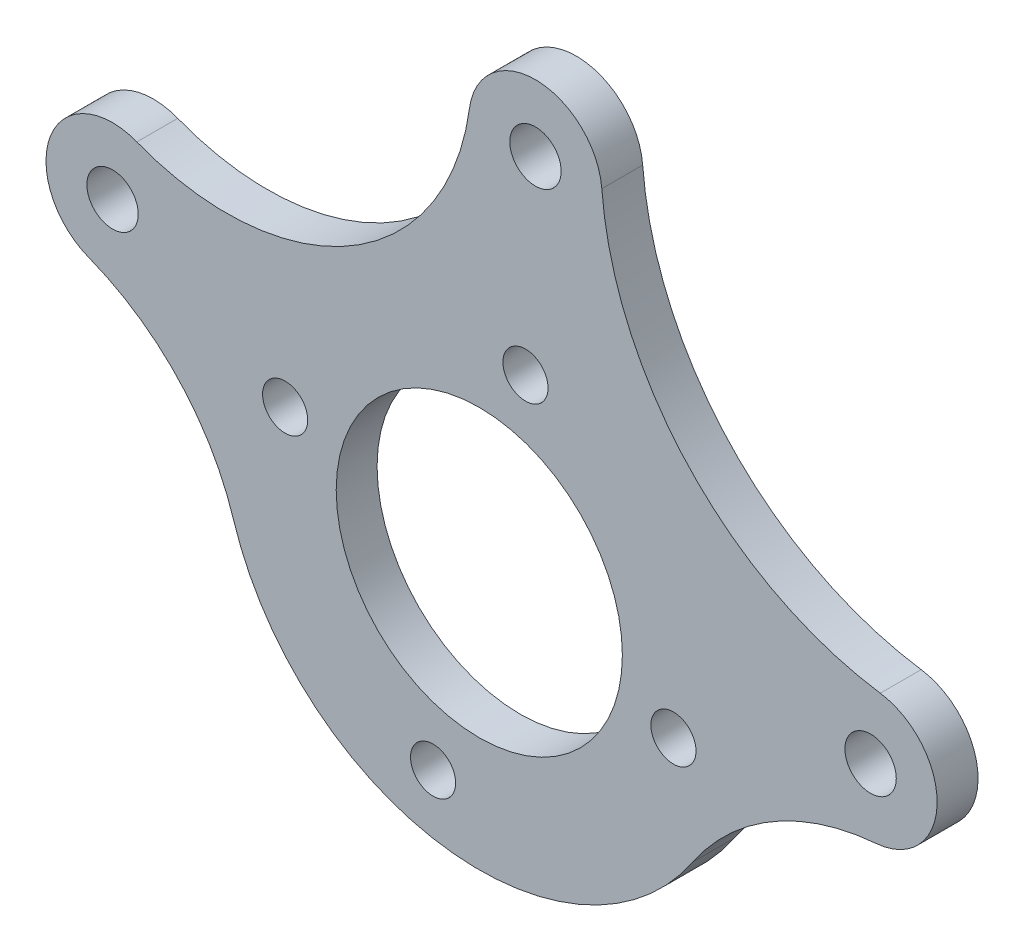
ISO-10303-21;
HEADER;
FILE_DESCRIPTION(('STEP AP214'),'2;1');
FILE_NAME('part.step','',(''),(''),'','','');
FILE_SCHEMA(('AUTOMOTIVE_DESIGN { 1 0 10303 214 1 1 1 1 }'));
ENDSEC;
DATA;
#1=APPLICATION_CONTEXT('core data for automotive mechanical design processes');
#2=APPLICATION_PROTOCOL_DEFINITION('international standard','automotive_design',2000,#1);
#3=PRODUCT_CONTEXT('',#1,'mechanical');
#4=PRODUCT('Part','Part','',(#3));
#5=PRODUCT_RELATED_PRODUCT_CATEGORY('part','',(#4));
#6=PRODUCT_DEFINITION_FORMATION('','',#4);
#7=PRODUCT_DEFINITION_CONTEXT('part definition',#1,'design');
#8=PRODUCT_DEFINITION('design','',#6,#7);
#9=PRODUCT_DEFINITION_SHAPE('','',#8);
#10=(LENGTH_UNIT() NAMED_UNIT(*) SI_UNIT(.MILLI.,.METRE.));
#11=(NAMED_UNIT(*) PLANE_ANGLE_UNIT() SI_UNIT($,.RADIAN.));
#12=(NAMED_UNIT(*) SI_UNIT($,.STERADIAN.) SOLID_ANGLE_UNIT());
#13=UNCERTAINTY_MEASURE_WITH_UNIT(LENGTH_MEASURE(1.E-05),#10,'distance_accuracy_value','');
#14=(GEOMETRIC_REPRESENTATION_CONTEXT(3) GLOBAL_UNCERTAINTY_ASSIGNED_CONTEXT((#13)) GLOBAL_UNIT_ASSIGNED_CONTEXT((#10,
#11,#12)) REPRESENTATION_CONTEXT('',''));
#15=CARTESIAN_POINT('',(0.,0.,0.));
#16=DIRECTION('',(0.,0.,1.));
#17=DIRECTION('',(1.,0.,0.));
#18=AXIS2_PLACEMENT_3D('',#15,#16,#17);
#19=CARTESIAN_POINT('',(217.264535685722,227.071383556608,3.175));
#20=DIRECTION('',(0.,0.,-1.));
#21=DIRECTION('',(-1.,0.,0.));
#22=AXIS2_PLACEMENT_3D('',#19,#20,#21);
#23=CYLINDRICAL_SURFACE('',#22,5.1689);
#24=CARTESIAN_POINT('',(217.264535685722,227.071383556608,0.));
#25=DIRECTION('',(0.,0.,1.));
#26=DIRECTION('',(1.,0.,0.));
#27=AXIS2_PLACEMENT_3D('',#24,#25,#26);
#28=CIRCLE('',#27,5.1689);
#29=CARTESIAN_POINT('',(219.151638290435,231.883490264619,0.));
#30=VERTEX_POINT('',#29);
#31=CARTESIAN_POINT('',(215.392533647705,222.253382354899,0.));
#32=VERTEX_POINT('',#31);
#33=EDGE_CURVE('E161',#30,#32,#28,.T.);
#34=ORIENTED_EDGE('',*,*,#33,.T.);
#35=DIRECTION('',(0.,0.,-1.));
#36=VECTOR('',#35,1.);
#37=CARTESIAN_POINT('',(215.392533647705,222.253382354899,3.175));
#38=LINE('',#37,#36);
#39=CARTESIAN_POINT('',(215.392533647705,222.253382354899,3.175));
#40=VERTEX_POINT('',#39);
#41=EDGE_CURVE('E11',#40,#32,#38,.T.);
#42=ORIENTED_EDGE('',*,*,#41,.F.);
#43=CARTESIAN_POINT('',(217.264535685722,227.071383556608,3.175));
#44=DIRECTION('',(0.,0.,1.));
#45=DIRECTION('',(1.,0.,0.));
#46=AXIS2_PLACEMENT_3D('',#43,#44,#45);
#47=CIRCLE('',#46,5.1689);
#48=CARTESIAN_POINT('',(219.151638290435,231.883490264619,3.175));
#49=VERTEX_POINT('',#48);
#50=EDGE_CURVE('E229',#49,#40,#47,.T.);
#51=ORIENTED_EDGE('',*,*,#50,.F.);
#52=DIRECTION('',(0.,0.,-1.));
#53=VECTOR('',#52,1.);
#54=CARTESIAN_POINT('',(219.151638290435,231.883490264619,3.175));
#55=LINE('',#54,#53);
#56=EDGE_CURVE('E157',#49,#30,#55,.T.);
#57=ORIENTED_EDGE('',*,*,#56,.T.);
#58=EDGE_LOOP('',(#34,#42,#51,#57));
#59=FACE_BOUND('',#58,.T.);
#60=ADVANCED_FACE('F39',(#59),#23,.T.);
#61=CARTESIAN_POINT('',(208.493263237325,204.496621169243,3.175));
#62=DIRECTION('',(0.,0.,-1.));
#63=DIRECTION('',(-1.,0.,0.));
#64=AXIS2_PLACEMENT_3D('',#61,#62,#63);
#65=CYLINDRICAL_SURFACE('',#64,19.05);
#66=CARTESIAN_POINT('',(208.493263237325,204.496621169243,0.));
#67=DIRECTION('',(0.,0.,1.));
#68=DIRECTION('',(1.,0.,0.));
#69=AXIS2_PLACEMENT_3D('',#66,#67,#68);
#70=CIRCLE('',#69,19.05);
#71=CARTESIAN_POINT('',(226.665274493401,210.213307876511,0.));
#72=VERTEX_POINT('',#71);
#73=EDGE_CURVE('E164',#32,#72,#70,.F.);
#74=ORIENTED_EDGE('',*,*,#73,.T.);
#75=DIRECTION('',(0.,0.,-1.));
#76=VECTOR('',#75,1.);
#77=CARTESIAN_POINT('',(226.665274493401,210.213307876511,3.175));
#78=LINE('',#77,#76);
#79=CARTESIAN_POINT('',(226.665274493401,210.213307876511,3.175));
#80=VERTEX_POINT('',#79);
#81=EDGE_CURVE('E48',#80,#72,#78,.T.);
#82=ORIENTED_EDGE('',*,*,#81,.F.);
#83=CARTESIAN_POINT('',(208.493263237325,204.496621169243,3.175));
#84=DIRECTION('',(0.,0.,1.));
#85=DIRECTION('',(1.,0.,0.));
#86=AXIS2_PLACEMENT_3D('',#83,#84,#85);
#87=CIRCLE('',#86,19.05);
#88=EDGE_CURVE('E99',#40,#80,#87,.F.);
#89=ORIENTED_EDGE('',*,*,#88,.F.);
#90=ORIENTED_EDGE('',*,*,#41,.T.);
#91=EDGE_LOOP('',(#74,#82,#89,#90));
#92=FACE_BOUND('',#91,.T.);
#93=ADVANCED_FACE('F248',(#92),#65,.F.);
#94=CARTESIAN_POINT('',(245.745886312281,216.215828919142,3.175));
#95=DIRECTION('',(0.,0.,-1.));
#96=DIRECTION('',(-1.,0.,0.));
#97=AXIS2_PLACEMENT_3D('',#94,#95,#96);
#98=CYLINDRICAL_SURFACE('',#97,20.0025000000005);
#99=CARTESIAN_POINT('',(245.745886312281,216.215828919142,0.));
#100=DIRECTION('',(0.,0.,1.));
#101=DIRECTION('',(1.,0.,0.));
#102=AXIS2_PLACEMENT_3D('',#99,#100,#101);
#103=CIRCLE('',#102,20.0025000000005);
#104=CARTESIAN_POINT('',(262.344318116659,205.053747218785,0.));
#105=VERTEX_POINT('',#104);
#106=EDGE_CURVE('E166',#72,#105,#103,.T.);
#107=ORIENTED_EDGE('',*,*,#106,.T.);
#108=DIRECTION('',(0.,0.,-1.));
#109=VECTOR('',#108,1.);
#110=CARTESIAN_POINT('',(262.344318116659,205.053747218785,3.175));
#111=LINE('',#110,#109);
#112=CARTESIAN_POINT('',(262.344318116659,205.053747218785,3.175));
#113=VERTEX_POINT('',#112);
#114=EDGE_CURVE('E203',#113,#105,#111,.T.);
#115=ORIENTED_EDGE('',*,*,#114,.F.);
#116=CARTESIAN_POINT('',(245.745886312281,216.215828919142,3.175));
#117=DIRECTION('',(0.,0.,1.));
#118=DIRECTION('',(1.,0.,0.));
#119=AXIS2_PLACEMENT_3D('',#116,#117,#118);
#120=CIRCLE('',#119,20.0025000000005);
#121=EDGE_CURVE('E211',#80,#113,#120,.T.);
#122=ORIENTED_EDGE('',*,*,#121,.F.);
#123=ORIENTED_EDGE('',*,*,#81,.T.);
#124=EDGE_LOOP('',(#107,#115,#122,#123));
#125=FACE_BOUND('',#124,.T.);
#126=ADVANCED_FACE('F209',(#125),#98,.T.);
#127=CARTESIAN_POINT('',(278.152348406542,194.423193218445,3.175));
#128=DIRECTION('',(0.,0.,-1.));
#129=DIRECTION('',(-1.,0.,0.));
#130=AXIS2_PLACEMENT_3D('',#127,#128,#129);
#131=CYLINDRICAL_SURFACE('',#130,19.05);
#132=CARTESIAN_POINT('',(278.152348406542,194.423193218445,0.));
#133=DIRECTION('',(0.,0.,1.));
#134=DIRECTION('',(1.,0.,0.));
#135=AXIS2_PLACEMENT_3D('',#132,#133,#134);
#136=CIRCLE('',#135,19.05);
#137=CARTESIAN_POINT('',(276.566152056881,213.407041119762,0.));
#138=VERTEX_POINT('',#137);
#139=EDGE_CURVE('E168',#105,#138,#136,.F.);
#140=ORIENTED_EDGE('',*,*,#139,.T.);
#141=DIRECTION('',(0.,0.,-1.));
#142=VECTOR('',#141,1.);
#143=CARTESIAN_POINT('',(276.566152056881,213.407041119762,3.175));
#144=LINE('',#143,#142);
#145=CARTESIAN_POINT('',(276.566152056881,213.407041119762,3.175));
#146=VERTEX_POINT('',#145);
#147=EDGE_CURVE('E200',#146,#138,#144,.T.);
#148=ORIENTED_EDGE('',*,*,#147,.F.);
#149=CARTESIAN_POINT('',(278.152348406542,194.423193218445,3.175));
#150=DIRECTION('',(0.,0.,1.));
#151=DIRECTION('',(1.,0.,0.));
#152=AXIS2_PLACEMENT_3D('',#149,#150,#151);
#153=CIRCLE('',#152,19.05);
#154=EDGE_CURVE('E224',#113,#146,#153,.F.);
#155=ORIENTED_EDGE('',*,*,#154,.F.);
#156=ORIENTED_EDGE('',*,*,#114,.T.);
#157=EDGE_LOOP('',(#140,#148,#155,#156));
#158=FACE_BOUND('',#157,.T.);
#159=ADVANCED_FACE('F220',(#158),#131,.F.);
#160=CARTESIAN_POINT('',(276.135764114007,218.557991850319,3.175));
#161=DIRECTION('',(0.,0.,-1.));
#162=DIRECTION('',(-1.,0.,0.));
#163=AXIS2_PLACEMENT_3D('',#160,#161,#162);
#164=CYLINDRICAL_SURFACE('',#163,5.1689);
#165=CARTESIAN_POINT('',(276.135764114007,218.557991850319,0.));
#166=DIRECTION('',(0.,0.,1.));
#167=DIRECTION('',(1.,0.,0.));
#168=AXIS2_PLACEMENT_3D('',#165,#166,#167);
#169=CIRCLE('',#168,5.1689);
#170=CARTESIAN_POINT('',(276.887443937685,223.67194381066,0.));
#171=VERTEX_POINT('',#170);
#172=EDGE_CURVE('E170',#138,#171,#169,.T.);
#173=ORIENTED_EDGE('',*,*,#172,.T.);
#174=DIRECTION('',(0.,0.,-1.));
#175=VECTOR('',#174,1.);
#176=CARTESIAN_POINT('',(276.887443937685,223.67194381066,3.175));
#177=LINE('',#176,#175);
#178=CARTESIAN_POINT('',(276.887443937685,223.67194381066,3.175));
#179=VERTEX_POINT('',#178);
#180=EDGE_CURVE('E128',#179,#171,#177,.T.);
#181=ORIENTED_EDGE('',*,*,#180,.F.);
#182=CARTESIAN_POINT('',(276.135764114007,218.557991850319,3.175));
#183=DIRECTION('',(0.,0.,1.));
#184=DIRECTION('',(1.,0.,0.));
#185=AXIS2_PLACEMENT_3D('',#182,#183,#184);
#186=CIRCLE('',#185,5.1689);
#187=EDGE_CURVE('E119',#146,#179,#186,.T.);
#188=ORIENTED_EDGE('',*,*,#187,.F.);
#189=ORIENTED_EDGE('',*,*,#147,.T.);
#190=EDGE_LOOP('',(#173,#181,#188,#189));
#191=FACE_BOUND('',#190,.T.);
#192=ADVANCED_FACE('F223',(#191),#164,.T.);
#193=CARTESIAN_POINT('',(280.581202284997,248.801928873761,3.175));
#194=DIRECTION('',(0.,0.,-1.));
#195=DIRECTION('',(-1.,0.,0.));
#196=AXIS2_PLACEMENT_3D('',#193,#194,#195);
#197=CYLINDRICAL_SURFACE('',#196,25.4);
#198=CARTESIAN_POINT('',(280.581202284997,248.801928873761,0.));
#199=DIRECTION('',(0.,0.,1.));
#200=DIRECTION('',(1.,0.,0.));
#201=AXIS2_PLACEMENT_3D('',#198,#199,#200);
#202=CIRCLE('',#201,25.4);
#203=CARTESIAN_POINT('',(255.260913008916,246.791219800931,0.));
#204=VERTEX_POINT('',#203);
#205=EDGE_CURVE('E127',#171,#204,#202,.F.);
#206=ORIENTED_EDGE('',*,*,#205,.T.);
#207=DIRECTION('',(0.,0.,-1.));
#208=VECTOR('',#207,1.);
#209=CARTESIAN_POINT('',(255.260913008916,246.791219800931,3.175));
#210=LINE('',#209,#208);
#211=CARTESIAN_POINT('',(255.260913008916,246.791219800931,3.175));
#212=VERTEX_POINT('',#211);
#213=EDGE_CURVE('E124',#212,#204,#210,.T.);
#214=ORIENTED_EDGE('',*,*,#213,.F.);
#215=CARTESIAN_POINT('',(280.581202284997,248.801928873761,3.175));
#216=DIRECTION('',(0.,0.,1.));
#217=DIRECTION('',(1.,0.,0.));
#218=AXIS2_PLACEMENT_3D('',#215,#216,#217);
#219=CIRCLE('',#218,25.4);
#220=EDGE_CURVE('E112',#179,#212,#219,.F.);
#221=ORIENTED_EDGE('',*,*,#220,.F.);
#222=ORIENTED_EDGE('',*,*,#180,.T.);
#223=EDGE_LOOP('',(#206,#214,#221,#222));
#224=FACE_BOUND('',#223,.T.);
#225=ADVANCED_FACE('F125',(#224),#197,.F.);
#226=CARTESIAN_POINT('',(250.108234141233,246.38204050461,3.175));
#227=DIRECTION('',(0.,0.,-1.));
#228=DIRECTION('',(-1.,0.,0.));
#229=AXIS2_PLACEMENT_3D('',#226,#227,#228);
#230=CYLINDRICAL_SURFACE('',#229,5.1689);
#231=CARTESIAN_POINT('',(250.108234141233,246.38204050461,0.));
#232=DIRECTION('',(0.,0.,1.));
#233=DIRECTION('',(1.,0.,0.));
#234=AXIS2_PLACEMENT_3D('',#231,#232,#233);
#235=CIRCLE('',#234,5.1689);
#236=CARTESIAN_POINT('',(244.985695806568,247.072785189634,0.));
#237=VERTEX_POINT('',#236);
#238=EDGE_CURVE('E85',#204,#237,#235,.T.);
#239=ORIENTED_EDGE('',*,*,#238,.T.);
#240=DIRECTION('',(0.,0.,-1.));
#241=VECTOR('',#240,1.);
#242=CARTESIAN_POINT('',(244.985695806568,247.072785189634,3.175));
#243=LINE('',#242,#241);
#244=CARTESIAN_POINT('',(244.985695806568,247.072785189634,3.175));
#245=VERTEX_POINT('',#244);
#246=EDGE_CURVE('E129',#245,#237,#243,.T.);
#247=ORIENTED_EDGE('',*,*,#246,.F.);
#248=CARTESIAN_POINT('',(250.108234141233,246.38204050461,3.175));
#249=DIRECTION('',(0.,0.,1.));
#250=DIRECTION('',(1.,0.,0.));
#251=AXIS2_PLACEMENT_3D('',#248,#249,#250);
#252=CIRCLE('',#251,5.1689);
#253=EDGE_CURVE('E117',#212,#245,#252,.T.);
#254=ORIENTED_EDGE('',*,*,#253,.F.);
#255=ORIENTED_EDGE('',*,*,#213,.T.);
#256=EDGE_LOOP('',(#239,#247,#254,#255));
#257=FACE_BOUND('',#256,.T.);
#258=ADVANCED_FACE('F131',(#257),#230,.T.);
#259=CARTESIAN_POINT('',(250.108234141233,246.38204050461,3.175));
#260=DIRECTION('',(0.,0.,-1.));
#261=DIRECTION('',(-1.,0.,0.));
#262=AXIS2_PLACEMENT_3D('',#259,#260,#261);
#263=CYLINDRICAL_SURFACE('',#262,1.99389999999997);
#264=CARTESIAN_POINT('',(250.108234141233,246.38204050461,3.175));
#265=DIRECTION('',(0.,0.,1.));
#266=DIRECTION('',(1.,0.,0.));
#267=AXIS2_PLACEMENT_3D('',#264,#265,#266);
#268=CIRCLE('',#267,1.99389999999997);
#269=CARTESIAN_POINT('',(252.102134141233,246.38204050461,3.175));
#270=VERTEX_POINT('',#269);
#271=EDGE_CURVE('E151',#270,#270,#268,.T.);
#272=ORIENTED_EDGE('',*,*,#271,.T.);
#273=EDGE_LOOP('',(#272));
#274=FACE_BOUND('',#273,.T.);
#275=CARTESIAN_POINT('',(250.108234141233,246.38204050461,0.));
#276=DIRECTION('',(0.,0.,1.));
#277=DIRECTION('',(1.,0.,0.));
#278=AXIS2_PLACEMENT_3D('',#275,#276,#277);
#279=CIRCLE('',#278,1.99389999999997);
#280=CARTESIAN_POINT('',(252.102134141233,246.38204050461,0.));
#281=VERTEX_POINT('',#280);
#282=EDGE_CURVE('E190',#281,#281,#279,.T.);
#283=ORIENTED_EDGE('',*,*,#282,.F.);
#284=EDGE_LOOP('',(#283));
#285=FACE_BOUND('',#284,.T.);
#286=ADVANCED_FACE('F265',(#274,#285),#263,.F.);
#287=CARTESIAN_POINT('',(230.667204704519,219.804832261539,3.175));
#288=DIRECTION('',(0.,0.,-1.));
#289=DIRECTION('',(-1.,0.,0.));
#290=AXIS2_PLACEMENT_3D('',#287,#288,#289);
#291=CYLINDRICAL_SURFACE('',#290,1.75260000000004);
#292=CARTESIAN_POINT('',(230.667204704519,219.804832261539,3.175));
#293=DIRECTION('',(0.,0.,1.));
#294=DIRECTION('',(1.,0.,0.));
#295=AXIS2_PLACEMENT_3D('',#292,#293,#294);
#296=CIRCLE('',#295,1.75260000000004);
#297=CARTESIAN_POINT('',(232.419804704519,219.804832261539,3.175));
#298=VERTEX_POINT('',#297);
#299=EDGE_CURVE('E148',#298,#298,#296,.T.);
#300=ORIENTED_EDGE('',*,*,#299,.T.);
#301=EDGE_LOOP('',(#300));
#302=FACE_BOUND('',#301,.T.);
#303=CARTESIAN_POINT('',(230.667204704519,219.804832261539,0.));
#304=DIRECTION('',(0.,0.,1.));
#305=DIRECTION('',(1.,0.,0.));
#306=AXIS2_PLACEMENT_3D('',#303,#304,#305);
#307=CIRCLE('',#306,1.75260000000004);
#308=CARTESIAN_POINT('',(232.419804704519,219.804832261539,0.));
#309=VERTEX_POINT('',#308);
#310=EDGE_CURVE('E187',#309,#309,#307,.T.);
#311=ORIENTED_EDGE('',*,*,#310,.F.);
#312=EDGE_LOOP('',(#311));
#313=FACE_BOUND('',#312,.T.);
#314=ADVANCED_FACE('F284',(#302,#313),#291,.F.);
#315=CARTESIAN_POINT('',(249.334889654678,231.294510526904,3.175));
#316=DIRECTION('',(0.,0.,-1.));
#317=DIRECTION('',(-1.,0.,0.));
#318=AXIS2_PLACEMENT_3D('',#315,#316,#317);
#319=CYLINDRICAL_SURFACE('',#318,1.75259999999982);
#320=CARTESIAN_POINT('',(249.334889654678,231.294510526904,3.175));
#321=DIRECTION('',(0.,0.,1.));
#322=DIRECTION('',(1.,0.,0.));
#323=AXIS2_PLACEMENT_3D('',#320,#321,#322);
#324=CIRCLE('',#323,1.75259999999982);
#325=CARTESIAN_POINT('',(251.087489654678,231.294510526904,3.175));
#326=VERTEX_POINT('',#325);
#327=EDGE_CURVE('E145',#326,#326,#324,.T.);
#328=ORIENTED_EDGE('',*,*,#327,.T.);
#329=EDGE_LOOP('',(#328));
#330=FACE_BOUND('',#329,.T.);
#331=CARTESIAN_POINT('',(249.334889654678,231.294510526904,0.));
#332=DIRECTION('',(0.,0.,1.));
#333=DIRECTION('',(1.,0.,0.));
#334=AXIS2_PLACEMENT_3D('',#331,#332,#333);
#335=CIRCLE('',#334,1.75259999999982);
#336=CARTESIAN_POINT('',(251.087489654678,231.294510526904,0.));
#337=VERTEX_POINT('',#336);
#338=EDGE_CURVE('E184',#337,#337,#335,.T.);
#339=ORIENTED_EDGE('',*,*,#338,.F.);
#340=EDGE_LOOP('',(#339));
#341=FACE_BOUND('',#340,.T.);
#342=ADVANCED_FACE('F280',(#330,#341),#319,.F.);
#343=CARTESIAN_POINT('',(260.824567920043,212.626825576745,3.175));
#344=DIRECTION('',(0.,0.,-1.));
#345=DIRECTION('',(-1.,0.,0.));
#346=AXIS2_PLACEMENT_3D('',#343,#344,#345);
#347=CYLINDRICAL_SURFACE('',#346,1.75260000000007);
#348=CARTESIAN_POINT('',(260.824567920043,212.626825576745,3.175));
#349=DIRECTION('',(0.,0.,1.));
#350=DIRECTION('',(1.,0.,0.));
#351=AXIS2_PLACEMENT_3D('',#348,#349,#350);
#352=CIRCLE('',#351,1.75260000000007);
#353=CARTESIAN_POINT('',(262.577167920043,212.626825576745,3.175));
#354=VERTEX_POINT('',#353);
#355=EDGE_CURVE('E142',#354,#354,#352,.T.);
#356=ORIENTED_EDGE('',*,*,#355,.T.);
#357=EDGE_LOOP('',(#356));
#358=FACE_BOUND('',#357,.T.);
#359=CARTESIAN_POINT('',(260.824567920043,212.626825576745,0.));
#360=DIRECTION('',(0.,0.,1.));
#361=DIRECTION('',(1.,0.,0.));
#362=AXIS2_PLACEMENT_3D('',#359,#360,#361);
#363=CIRCLE('',#362,1.75260000000007);
#364=CARTESIAN_POINT('',(262.577167920043,212.626825576745,0.));
#365=VERTEX_POINT('',#364);
#366=EDGE_CURVE('E181',#365,#365,#363,.T.);
#367=ORIENTED_EDGE('',*,*,#366,.F.);
#368=EDGE_LOOP('',(#367));
#369=FACE_BOUND('',#368,.T.);
#370=ADVANCED_FACE('F276',(#358,#369),#347,.F.);
#371=CARTESIAN_POINT('',(242.156882969884,201.13714731138,3.175));
#372=DIRECTION('',(0.,0.,-1.));
#373=DIRECTION('',(-1.,0.,0.));
#374=AXIS2_PLACEMENT_3D('',#371,#372,#373);
#375=CYLINDRICAL_SURFACE('',#374,1.75260000000015);
#376=CARTESIAN_POINT('',(242.156882969884,201.13714731138,3.175));
#377=DIRECTION('',(0.,0.,1.));
#378=DIRECTION('',(1.,0.,0.));
#379=AXIS2_PLACEMENT_3D('',#376,#377,#378);
#380=CIRCLE('',#379,1.75260000000015);
#381=CARTESIAN_POINT('',(243.909482969884,201.13714731138,3.175));
#382=VERTEX_POINT('',#381);
#383=EDGE_CURVE('E139',#382,#382,#380,.T.);
#384=ORIENTED_EDGE('',*,*,#383,.T.);
#385=EDGE_LOOP('',(#384));
#386=FACE_BOUND('',#385,.T.);
#387=CARTESIAN_POINT('',(242.156882969884,201.13714731138,0.));
#388=DIRECTION('',(0.,0.,1.));
#389=DIRECTION('',(1.,0.,0.));
#390=AXIS2_PLACEMENT_3D('',#387,#388,#389);
#391=CIRCLE('',#390,1.75260000000015);
#392=CARTESIAN_POINT('',(243.909482969884,201.13714731138,0.));
#393=VERTEX_POINT('',#392);
#394=EDGE_CURVE('E178',#393,#393,#391,.T.);
#395=ORIENTED_EDGE('',*,*,#394,.F.);
#396=EDGE_LOOP('',(#395));
#397=FACE_BOUND('',#396,.T.);
#398=ADVANCED_FACE('F272',(#386,#397),#375,.F.);
#399=CARTESIAN_POINT('',(245.745886312281,216.215828919142,3.175));
#400=DIRECTION('',(0.,0.,-1.));
#401=DIRECTION('',(-1.,0.,0.));
#402=AXIS2_PLACEMENT_3D('',#399,#400,#401);
#403=CYLINDRICAL_SURFACE('',#402,11.1125000000005);
#404=CARTESIAN_POINT('',(245.745886312281,216.215828919142,3.175));
#405=DIRECTION('',(0.,0.,1.));
#406=DIRECTION('',(1.,0.,0.));
#407=AXIS2_PLACEMENT_3D('',#404,#405,#406);
#408=CIRCLE('',#407,11.1125000000005);
#409=CARTESIAN_POINT('',(256.858386312282,216.215828919142,3.175));
#410=VERTEX_POINT('',#409);
#411=EDGE_CURVE('E133',#410,#410,#408,.T.);
#412=ORIENTED_EDGE('',*,*,#411,.T.);
#413=EDGE_LOOP('',(#412));
#414=FACE_BOUND('',#413,.T.);
#415=CARTESIAN_POINT('',(245.745886312281,216.215828919142,0.));
#416=DIRECTION('',(0.,0.,1.));
#417=DIRECTION('',(1.,0.,0.));
#418=AXIS2_PLACEMENT_3D('',#415,#416,#417);
#419=CIRCLE('',#418,11.1125000000005);
#420=CARTESIAN_POINT('',(256.858386312282,216.215828919142,0.));
#421=VERTEX_POINT('',#420);
#422=EDGE_CURVE('E175',#421,#421,#419,.T.);
#423=ORIENTED_EDGE('',*,*,#422,.F.);
#424=EDGE_LOOP('',(#423));
#425=FACE_BOUND('',#424,.T.);
#426=ADVANCED_FACE('F269',(#414,#425),#403,.F.);
#427=CARTESIAN_POINT('',(226.106561895027,249.618527272031,3.175));
#428=DIRECTION('',(0.,0.,-1.));
#429=DIRECTION('',(-1.,0.,0.));
#430=AXIS2_PLACEMENT_3D('',#427,#428,#429);
#431=CYLINDRICAL_SURFACE('',#430,19.05);
#432=CARTESIAN_POINT('',(226.106561895027,249.618527272031,0.));
#433=DIRECTION('',(0.,0.,1.));
#434=DIRECTION('',(1.,0.,0.));
#435=AXIS2_PLACEMENT_3D('',#432,#433,#434);
#436=CIRCLE('',#435,19.05);
#437=EDGE_CURVE('E91',#237,#30,#436,.F.);
#438=ORIENTED_EDGE('',*,*,#437,.T.);
#439=ORIENTED_EDGE('',*,*,#56,.F.);
#440=CARTESIAN_POINT('',(226.106561895027,249.618527272031,3.175));
#441=DIRECTION('',(0.,0.,1.));
#442=DIRECTION('',(1.,0.,0.));
#443=AXIS2_PLACEMENT_3D('',#440,#441,#442);
#444=CIRCLE('',#443,19.05);
#445=EDGE_CURVE('E56',#245,#49,#444,.F.);
#446=ORIENTED_EDGE('',*,*,#445,.F.);
#447=ORIENTED_EDGE('',*,*,#246,.T.);
#448=EDGE_LOOP('',(#438,#439,#446,#447));
#449=FACE_BOUND('',#448,.T.);
#450=ADVANCED_FACE('F266',(#449),#431,.F.);
#451=CARTESIAN_POINT('',(217.264535685722,227.071383556608,3.175));
#452=DIRECTION('',(0.,0.,-1.));
#453=DIRECTION('',(-1.,0.,0.));
#454=AXIS2_PLACEMENT_3D('',#451,#452,#453);
#455=CYLINDRICAL_SURFACE('',#454,1.9939);
#456=CARTESIAN_POINT('',(217.264535685722,227.071383556608,3.175));
#457=DIRECTION('',(0.,0.,1.));
#458=DIRECTION('',(1.,0.,0.));
#459=AXIS2_PLACEMENT_3D('',#456,#457,#458);
#460=CIRCLE('',#459,1.9939);
#461=CARTESIAN_POINT('',(219.258435685722,227.071383556608,3.175));
#462=VERTEX_POINT('',#461);
#463=EDGE_CURVE('E196',#462,#462,#460,.T.);
#464=ORIENTED_EDGE('',*,*,#463,.T.);
#465=EDGE_LOOP('',(#464));
#466=FACE_BOUND('',#465,.T.);
#467=CARTESIAN_POINT('',(217.264535685722,227.071383556608,0.));
#468=DIRECTION('',(0.,0.,1.));
#469=DIRECTION('',(1.,0.,0.));
#470=AXIS2_PLACEMENT_3D('',#467,#468,#469);
#471=CIRCLE('',#470,1.9939);
#472=CARTESIAN_POINT('',(219.258435685722,227.071383556608,0.));
#473=VERTEX_POINT('',#472);
#474=EDGE_CURVE('E158',#473,#473,#471,.T.);
#475=ORIENTED_EDGE('',*,*,#474,.F.);
#476=EDGE_LOOP('',(#475));
#477=FACE_BOUND('',#476,.T.);
#478=ADVANCED_FACE('F41',(#466,#477),#455,.F.);
#479=CARTESIAN_POINT('',(276.135764114007,218.557991850319,3.175));
#480=DIRECTION('',(0.,0.,-1.));
#481=DIRECTION('',(-1.,0.,0.));
#482=AXIS2_PLACEMENT_3D('',#479,#480,#481);
#483=CYLINDRICAL_SURFACE('',#482,1.99389999999997);
#484=CARTESIAN_POINT('',(276.135764114007,218.557991850319,3.175));
#485=DIRECTION('',(0.,0.,1.));
#486=DIRECTION('',(1.,0.,0.));
#487=AXIS2_PLACEMENT_3D('',#484,#485,#486);
#488=CIRCLE('',#487,1.99389999999997);
#489=CARTESIAN_POINT('',(278.129664114007,218.557991850319,3.175));
#490=VERTEX_POINT('',#489);
#491=EDGE_CURVE('E154',#490,#490,#488,.T.);
#492=ORIENTED_EDGE('',*,*,#491,.T.);
#493=EDGE_LOOP('',(#492));
#494=FACE_BOUND('',#493,.T.);
#495=CARTESIAN_POINT('',(276.135764114007,218.557991850319,0.));
#496=DIRECTION('',(0.,0.,1.));
#497=DIRECTION('',(1.,0.,0.));
#498=AXIS2_PLACEMENT_3D('',#495,#496,#497);
#499=CIRCLE('',#498,1.99389999999997);
#500=CARTESIAN_POINT('',(278.129664114007,218.557991850319,0.));
#501=VERTEX_POINT('',#500);
#502=EDGE_CURVE('E193',#501,#501,#499,.T.);
#503=ORIENTED_EDGE('',*,*,#502,.F.);
#504=EDGE_LOOP('',(#503));
#505=FACE_BOUND('',#504,.T.);
#506=ADVANCED_FACE('F237',(#494,#505),#483,.F.);
#507=CARTESIAN_POINT('',(0.,0.,3.175));
#508=DIRECTION('',(0.,0.,1.));
#509=DIRECTION('',(1.,0.,0.));
#510=AXIS2_PLACEMENT_3D('',#507,#508,#509);
#511=PLANE('',#510);
#512=ORIENTED_EDGE('',*,*,#463,.F.);
#513=EDGE_LOOP('',(#512));
#514=FACE_BOUND('',#513,.T.);
#515=ORIENTED_EDGE('',*,*,#50,.T.);
#516=ORIENTED_EDGE('',*,*,#88,.T.);
#517=ORIENTED_EDGE('',*,*,#121,.T.);
#518=ORIENTED_EDGE('',*,*,#154,.T.);
#519=ORIENTED_EDGE('',*,*,#187,.T.);
#520=ORIENTED_EDGE('',*,*,#220,.T.);
#521=ORIENTED_EDGE('',*,*,#253,.T.);
#522=ORIENTED_EDGE('',*,*,#445,.T.);
#523=EDGE_LOOP('',(#515,#516,#517,#518,#519,#520,#521,#522));
#524=FACE_BOUND('',#523,.T.);
#525=ORIENTED_EDGE('',*,*,#411,.F.);
#526=EDGE_LOOP('',(#525));
#527=FACE_BOUND('',#526,.T.);
#528=ORIENTED_EDGE('',*,*,#383,.F.);
#529=EDGE_LOOP('',(#528));
#530=FACE_BOUND('',#529,.T.);
#531=ORIENTED_EDGE('',*,*,#355,.F.);
#532=EDGE_LOOP('',(#531));
#533=FACE_BOUND('',#532,.T.);
#534=ORIENTED_EDGE('',*,*,#327,.F.);
#535=EDGE_LOOP('',(#534));
#536=FACE_BOUND('',#535,.T.);
#537=ORIENTED_EDGE('',*,*,#299,.F.);
#538=EDGE_LOOP('',(#537));
#539=FACE_BOUND('',#538,.T.);
#540=ORIENTED_EDGE('',*,*,#271,.F.);
#541=EDGE_LOOP('',(#540));
#542=FACE_BOUND('',#541,.T.);
#543=ORIENTED_EDGE('',*,*,#491,.F.);
#544=EDGE_LOOP('',(#543));
#545=FACE_BOUND('',#544,.T.);
#546=ADVANCED_FACE('F114',(#514,#524,#527,#530,#533,#536,#539,#542,#545),#511,.T.);
#547=CARTESIAN_POINT('',(0.,0.,0.));
#548=DIRECTION('',(0.,0.,1.));
#549=DIRECTION('',(1.,0.,0.));
#550=AXIS2_PLACEMENT_3D('',#547,#548,#549);
#551=PLANE('',#550);
#552=ORIENTED_EDGE('',*,*,#474,.T.);
#553=EDGE_LOOP('',(#552));
#554=FACE_BOUND('',#553,.T.);
#555=ORIENTED_EDGE('',*,*,#33,.F.);
#556=ORIENTED_EDGE('',*,*,#437,.F.);
#557=ORIENTED_EDGE('',*,*,#238,.F.);
#558=ORIENTED_EDGE('',*,*,#205,.F.);
#559=ORIENTED_EDGE('',*,*,#172,.F.);
#560=ORIENTED_EDGE('',*,*,#139,.F.);
#561=ORIENTED_EDGE('',*,*,#106,.F.);
#562=ORIENTED_EDGE('',*,*,#73,.F.);
#563=EDGE_LOOP('',(#555,#556,#557,#558,#559,#560,#561,#562));
#564=FACE_BOUND('',#563,.T.);
#565=ORIENTED_EDGE('',*,*,#422,.T.);
#566=EDGE_LOOP('',(#565));
#567=FACE_BOUND('',#566,.T.);
#568=ORIENTED_EDGE('',*,*,#394,.T.);
#569=EDGE_LOOP('',(#568));
#570=FACE_BOUND('',#569,.T.);
#571=ORIENTED_EDGE('',*,*,#366,.T.);
#572=EDGE_LOOP('',(#571));
#573=FACE_BOUND('',#572,.T.);
#574=ORIENTED_EDGE('',*,*,#338,.T.);
#575=EDGE_LOOP('',(#574));
#576=FACE_BOUND('',#575,.T.);
#577=ORIENTED_EDGE('',*,*,#310,.T.);
#578=EDGE_LOOP('',(#577));
#579=FACE_BOUND('',#578,.T.);
#580=ORIENTED_EDGE('',*,*,#282,.T.);
#581=EDGE_LOOP('',(#580));
#582=FACE_BOUND('',#581,.T.);
#583=ORIENTED_EDGE('',*,*,#502,.T.);
#584=EDGE_LOOP('',(#583));
#585=FACE_BOUND('',#584,.T.);
#586=ADVANCED_FACE('F215',(#554,#564,#567,#570,#573,#576,#579,#582,#585),#551,.F.);
#587=CLOSED_SHELL('',(#60,#93,#126,#159,#192,#225,#258,#286,#314,#342,#370,#398,#426,#450,#478,
#506,#546,#586));
#588=MANIFOLD_SOLID_BREP('B2',#587);
#589=ADVANCED_BREP_SHAPE_REPRESENTATION('',(#18,#588),#14);
#590=SHAPE_DEFINITION_REPRESENTATION(#9,#589);
ENDSEC;
END-ISO-10303-21;
